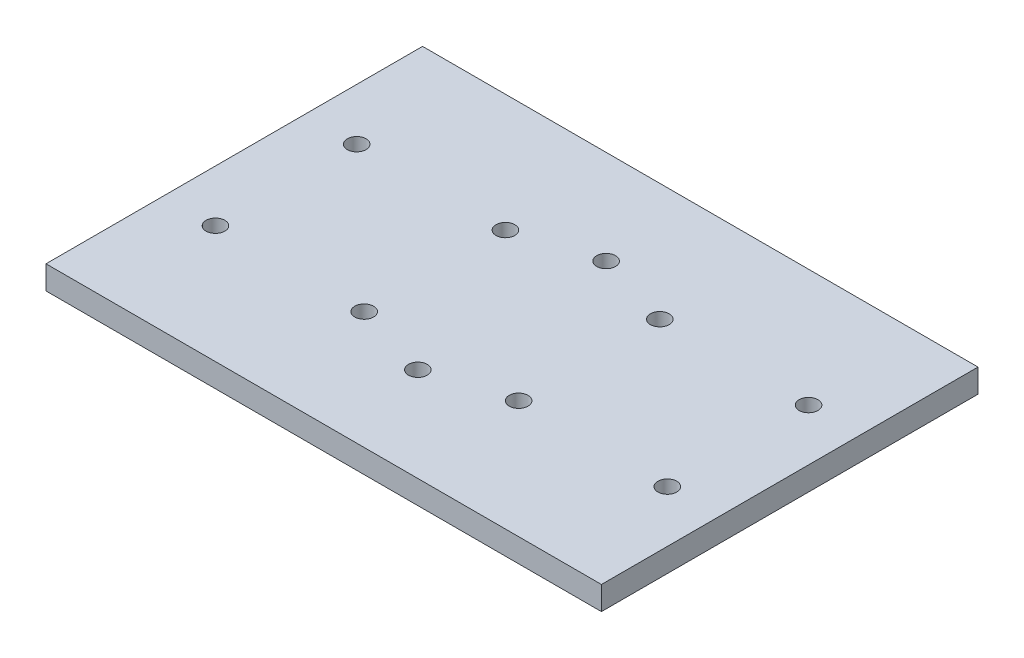
ISO-10303-21;
HEADER;
FILE_DESCRIPTION(('STEP AP214'),'2;1');
FILE_NAME('part.step','',(''),(''),'','','');
FILE_SCHEMA(('AUTOMOTIVE_DESIGN { 1 0 10303 214 1 1 1 1 }'));
ENDSEC;
DATA;
#1=APPLICATION_CONTEXT('core data for automotive mechanical design processes');
#2=APPLICATION_PROTOCOL_DEFINITION('international standard','automotive_design',2000,#1);
#3=PRODUCT_CONTEXT('',#1,'mechanical');
#4=PRODUCT('Part','Part','',(#3));
#5=PRODUCT_RELATED_PRODUCT_CATEGORY('part','',(#4));
#6=PRODUCT_DEFINITION_FORMATION('','',#4);
#7=PRODUCT_DEFINITION_CONTEXT('part definition',#1,'design');
#8=PRODUCT_DEFINITION('design','',#6,#7);
#9=PRODUCT_DEFINITION_SHAPE('','',#8);
#10=(LENGTH_UNIT() NAMED_UNIT(*) SI_UNIT(.MILLI.,.METRE.));
#11=(NAMED_UNIT(*) PLANE_ANGLE_UNIT() SI_UNIT($,.RADIAN.));
#12=(NAMED_UNIT(*) SI_UNIT($,.STERADIAN.) SOLID_ANGLE_UNIT());
#13=UNCERTAINTY_MEASURE_WITH_UNIT(LENGTH_MEASURE(1.E-05),#10,'distance_accuracy_value','');
#14=(GEOMETRIC_REPRESENTATION_CONTEXT(3) GLOBAL_UNCERTAINTY_ASSIGNED_CONTEXT((#13)) GLOBAL_UNIT_ASSIGNED_CONTEXT((#10,
#11,#12)) REPRESENTATION_CONTEXT('',''));
#15=CARTESIAN_POINT('',(0.,0.,0.));
#16=DIRECTION('',(0.,0.,1.));
#17=DIRECTION('',(1.,0.,0.));
#18=AXIS2_PLACEMENT_3D('',#15,#16,#17);
#19=CARTESIAN_POINT('',(-300.057142857143,5.,-77.9642857142857));
#20=DIRECTION('',(1.,0.,0.));
#21=DIRECTION('',(0.,0.,-1.));
#22=AXIS2_PLACEMENT_3D('',#19,#20,#21);
#23=PLANE('',#22);
#24=DIRECTION('',(0.,0.,1.));
#25=VECTOR('',#24,1.);
#26=CARTESIAN_POINT('',(-300.057142857143,0.,-77.9642857142857));
#27=LINE('',#26,#25);
#28=CARTESIAN_POINT('',(-300.057142857143,0.,-77.9642857142857));
#29=VERTEX_POINT('',#28);
#30=CARTESIAN_POINT('',(-300.057142857143,0.,2.03571428571428));
#31=VERTEX_POINT('',#30);
#32=EDGE_CURVE('E96',#29,#31,#27,.T.);
#33=ORIENTED_EDGE('',*,*,#32,.T.);
#34=DIRECTION('',(0.,-1.,0.));
#35=VECTOR('',#34,1.);
#36=CARTESIAN_POINT('',(-300.057142857143,5.,2.03571428571428));
#37=LINE('',#36,#35);
#38=CARTESIAN_POINT('',(-300.057142857143,5.,2.03571428571428));
#39=VERTEX_POINT('',#38);
#40=EDGE_CURVE('E11',#39,#31,#37,.T.);
#41=ORIENTED_EDGE('',*,*,#40,.F.);
#42=DIRECTION('',(0.,0.,1.));
#43=VECTOR('',#42,1.);
#44=CARTESIAN_POINT('',(-300.057142857143,5.,-77.9642857142857));
#45=LINE('',#44,#43);
#46=CARTESIAN_POINT('',(-300.057142857143,5.,-77.9642857142857));
#47=VERTEX_POINT('',#46);
#48=EDGE_CURVE('E84',#47,#39,#45,.T.);
#49=ORIENTED_EDGE('',*,*,#48,.F.);
#50=DIRECTION('',(0.,-1.,0.));
#51=VECTOR('',#50,1.);
#52=CARTESIAN_POINT('',(-300.057142857143,5.,-77.9642857142857));
#53=LINE('',#52,#51);
#54=EDGE_CURVE('E92',#47,#29,#53,.T.);
#55=ORIENTED_EDGE('',*,*,#54,.T.);
#56=EDGE_LOOP('',(#33,#41,#49,#55));
#57=FACE_BOUND('',#56,.T.);
#58=ADVANCED_FACE('F33',(#57),#23,.F.);
#59=CARTESIAN_POINT('',(-300.057142857143,5.,2.03571428571428));
#60=DIRECTION('',(0.,0.,-1.));
#61=DIRECTION('',(-1.,0.,0.));
#62=AXIS2_PLACEMENT_3D('',#59,#60,#61);
#63=PLANE('',#62);
#64=DIRECTION('',(1.,0.,0.));
#65=VECTOR('',#64,1.);
#66=CARTESIAN_POINT('',(-300.057142857143,0.,2.03571428571428));
#67=LINE('',#66,#65);
#68=CARTESIAN_POINT('',(-182.057142857143,0.,2.03571428571428));
#69=VERTEX_POINT('',#68);
#70=EDGE_CURVE('E88',#31,#69,#67,.T.);
#71=ORIENTED_EDGE('',*,*,#70,.T.);
#72=DIRECTION('',(0.,-1.,0.));
#73=VECTOR('',#72,1.);
#74=CARTESIAN_POINT('',(-182.057142857143,5.,2.03571428571428));
#75=LINE('',#74,#73);
#76=CARTESIAN_POINT('',(-182.057142857143,5.,2.03571428571428));
#77=VERTEX_POINT('',#76);
#78=EDGE_CURVE('E41',#77,#69,#75,.T.);
#79=ORIENTED_EDGE('',*,*,#78,.F.);
#80=DIRECTION('',(1.,0.,0.));
#81=VECTOR('',#80,1.);
#82=CARTESIAN_POINT('',(-300.057142857143,5.,2.03571428571428));
#83=LINE('',#82,#81);
#84=EDGE_CURVE('E79',#39,#77,#83,.T.);
#85=ORIENTED_EDGE('',*,*,#84,.F.);
#86=ORIENTED_EDGE('',*,*,#40,.T.);
#87=EDGE_LOOP('',(#71,#79,#85,#86));
#88=FACE_BOUND('',#87,.T.);
#89=ADVANCED_FACE('F87',(#88),#63,.F.);
#90=CARTESIAN_POINT('',(-182.057142857143,5.,-77.9642857142857));
#91=DIRECTION('',(-1.,0.,0.));
#92=DIRECTION('',(0.,0.,1.));
#93=AXIS2_PLACEMENT_3D('',#90,#91,#92);
#94=PLANE('',#93);
#95=DIRECTION('',(0.,0.,-1.));
#96=VECTOR('',#95,1.);
#97=CARTESIAN_POINT('',(-182.057142857143,0.,-77.9642857142857));
#98=LINE('',#97,#96);
#99=CARTESIAN_POINT('',(-182.057142857143,0.,-77.9642857142857));
#100=VERTEX_POINT('',#99);
#101=EDGE_CURVE('E66',#69,#100,#98,.T.);
#102=ORIENTED_EDGE('',*,*,#101,.T.);
#103=DIRECTION('',(0.,-1.,0.));
#104=VECTOR('',#103,1.);
#105=CARTESIAN_POINT('',(-182.057142857143,5.,-77.9642857142857));
#106=LINE('',#105,#104);
#107=CARTESIAN_POINT('',(-182.057142857143,5.,-77.9642857142857));
#108=VERTEX_POINT('',#107);
#109=EDGE_CURVE('E89',#108,#100,#106,.T.);
#110=ORIENTED_EDGE('',*,*,#109,.F.);
#111=DIRECTION('',(0.,0.,-1.));
#112=VECTOR('',#111,1.);
#113=CARTESIAN_POINT('',(-182.057142857143,5.,-77.9642857142857));
#114=LINE('',#113,#112);
#115=EDGE_CURVE('E82',#77,#108,#114,.T.);
#116=ORIENTED_EDGE('',*,*,#115,.F.);
#117=ORIENTED_EDGE('',*,*,#78,.T.);
#118=EDGE_LOOP('',(#102,#110,#116,#117));
#119=FACE_BOUND('',#118,.T.);
#120=ADVANCED_FACE('F90',(#119),#94,.F.);
#121=CARTESIAN_POINT('',(-300.057142857143,5.,-77.9642857142857));
#122=DIRECTION('',(0.,0.,1.));
#123=DIRECTION('',(1.,0.,0.));
#124=AXIS2_PLACEMENT_3D('',#121,#122,#123);
#125=PLANE('',#124);
#126=DIRECTION('',(-1.,0.,0.));
#127=VECTOR('',#126,1.);
#128=CARTESIAN_POINT('',(-300.057142857143,0.,-77.9642857142857));
#129=LINE('',#128,#127);
#130=EDGE_CURVE('E72',#100,#29,#129,.T.);
#131=ORIENTED_EDGE('',*,*,#130,.T.);
#132=ORIENTED_EDGE('',*,*,#54,.F.);
#133=DIRECTION('',(-1.,0.,0.));
#134=VECTOR('',#133,1.);
#135=CARTESIAN_POINT('',(-300.057142857143,5.,-77.9642857142857));
#136=LINE('',#135,#134);
#137=EDGE_CURVE('E49',#108,#47,#136,.T.);
#138=ORIENTED_EDGE('',*,*,#137,.F.);
#139=ORIENTED_EDGE('',*,*,#109,.T.);
#140=EDGE_LOOP('',(#131,#132,#138,#139));
#141=FACE_BOUND('',#140,.T.);
#142=ADVANCED_FACE('F104',(#141),#125,.F.);
#143=CARTESIAN_POINT('',(0.,5.,0.));
#144=DIRECTION('',(0.,1.,0.));
#145=DIRECTION('',(0.,0.,1.));
#146=AXIS2_PLACEMENT_3D('',#143,#144,#145);
#147=PLANE('',#146);
#148=CARTESIAN_POINT('',(-241.057142857143,5.,-17.9642857142857));
#149=DIRECTION('',(0.,1.,0.));
#150=DIRECTION('',(0.,0.,-1.));
#151=AXIS2_PLACEMENT_3D('',#148,#149,#150);
#152=CIRCLE('',#151,2.);
#153=CARTESIAN_POINT('',(-241.057142857143,5.,-19.9642857142857));
#154=VERTEX_POINT('',#153);
#155=EDGE_CURVE('E116',#154,#154,#152,.T.);
#156=ORIENTED_EDGE('',*,*,#155,.F.);
#157=EDGE_LOOP('',(#156));
#158=FACE_BOUND('',#157,.T.);
#159=CARTESIAN_POINT('',(-257.457142857143,5.,-52.964285714286));
#160=DIRECTION('',(0.,1.,0.));
#161=DIRECTION('',(0.,0.,1.));
#162=AXIS2_PLACEMENT_3D('',#159,#160,#161);
#163=CIRCLE('',#162,2.);
#164=CARTESIAN_POINT('',(-257.457142857143,5.,-50.964285714286));
#165=VERTEX_POINT('',#164);
#166=EDGE_CURVE('E142',#165,#165,#163,.T.);
#167=ORIENTED_EDGE('',*,*,#166,.F.);
#168=EDGE_LOOP('',(#167));
#169=FACE_BOUND('',#168,.T.);
#170=CARTESIAN_POINT('',(-224.657142857143,5.,-52.964285714286));
#171=DIRECTION('',(0.,1.,0.));
#172=DIRECTION('',(0.,0.,-1.));
#173=AXIS2_PLACEMENT_3D('',#170,#171,#172);
#174=CIRCLE('',#173,2.);
#175=CARTESIAN_POINT('',(-224.657142857143,5.,-54.964285714286));
#176=VERTEX_POINT('',#175);
#177=EDGE_CURVE('E136',#176,#176,#174,.T.);
#178=ORIENTED_EDGE('',*,*,#177,.F.);
#179=EDGE_LOOP('',(#178));
#180=FACE_BOUND('',#179,.T.);
#181=CARTESIAN_POINT('',(-193.057142857143,5.,-52.964285714286));
#182=DIRECTION('',(0.,1.,0.));
#183=DIRECTION('',(0.,0.,-1.));
#184=AXIS2_PLACEMENT_3D('',#181,#182,#183);
#185=CIRCLE('',#184,2.);
#186=CARTESIAN_POINT('',(-193.057142857143,5.,-54.964285714286));
#187=VERTEX_POINT('',#186);
#188=EDGE_CURVE('E130',#187,#187,#185,.T.);
#189=ORIENTED_EDGE('',*,*,#188,.F.);
#190=EDGE_LOOP('',(#189));
#191=FACE_BOUND('',#190,.T.);
#192=CARTESIAN_POINT('',(-193.057142857143,5.,-22.9642857142855));
#193=DIRECTION('',(0.,1.,0.));
#194=DIRECTION('',(0.,0.,1.));
#195=AXIS2_PLACEMENT_3D('',#192,#193,#194);
#196=CIRCLE('',#195,2.);
#197=CARTESIAN_POINT('',(-193.057142857143,5.,-20.9642857142855));
#198=VERTEX_POINT('',#197);
#199=EDGE_CURVE('E123',#198,#198,#196,.T.);
#200=ORIENTED_EDGE('',*,*,#199,.F.);
#201=EDGE_LOOP('',(#200));
#202=FACE_BOUND('',#201,.T.);
#203=CARTESIAN_POINT('',(-241.057142857143,5.,-57.9642857142857));
#204=DIRECTION('',(0.,1.,0.));
#205=DIRECTION('',(0.,0.,1.));
#206=AXIS2_PLACEMENT_3D('',#203,#204,#205);
#207=CIRCLE('',#206,2.);
#208=CARTESIAN_POINT('',(-241.057142857143,5.,-55.9642857142857));
#209=VERTEX_POINT('',#208);
#210=EDGE_CURVE('E122',#209,#209,#207,.T.);
#211=ORIENTED_EDGE('',*,*,#210,.F.);
#212=EDGE_LOOP('',(#211));
#213=FACE_BOUND('',#212,.T.);
#214=CARTESIAN_POINT('',(-289.057142857143,5.,-22.9642857142855));
#215=DIRECTION('',(0.,1.,0.));
#216=DIRECTION('',(0.,0.,-1.));
#217=AXIS2_PLACEMENT_3D('',#214,#215,#216);
#218=CIRCLE('',#217,2.);
#219=CARTESIAN_POINT('',(-289.057142857143,5.,-24.9642857142855));
#220=VERTEX_POINT('',#219);
#221=EDGE_CURVE('E164',#220,#220,#218,.T.);
#222=ORIENTED_EDGE('',*,*,#221,.F.);
#223=EDGE_LOOP('',(#222));
#224=FACE_BOUND('',#223,.T.);
#225=CARTESIAN_POINT('',(-257.457142857143,5.,-22.9642857142855));
#226=DIRECTION('',(0.,1.,0.));
#227=DIRECTION('',(0.,0.,-1.));
#228=AXIS2_PLACEMENT_3D('',#225,#226,#227);
#229=CIRCLE('',#228,2.);
#230=CARTESIAN_POINT('',(-257.457142857143,5.,-24.9642857142855));
#231=VERTEX_POINT('',#230);
#232=EDGE_CURVE('E147',#231,#231,#229,.T.);
#233=ORIENTED_EDGE('',*,*,#232,.F.);
#234=EDGE_LOOP('',(#233));
#235=FACE_BOUND('',#234,.T.);
#236=CARTESIAN_POINT('',(-224.657142857143,5.,-22.9642857142855));
#237=DIRECTION('',(0.,1.,0.));
#238=DIRECTION('',(0.,0.,1.));
#239=AXIS2_PLACEMENT_3D('',#236,#237,#238);
#240=CIRCLE('',#239,2.);
#241=CARTESIAN_POINT('',(-224.657142857143,5.,-20.9642857142855));
#242=VERTEX_POINT('',#241);
#243=EDGE_CURVE('E154',#242,#242,#240,.T.);
#244=ORIENTED_EDGE('',*,*,#243,.F.);
#245=EDGE_LOOP('',(#244));
#246=FACE_BOUND('',#245,.T.);
#247=CARTESIAN_POINT('',(-289.057142857143,5.,-52.964285714286));
#248=DIRECTION('',(0.,1.,0.));
#249=DIRECTION('',(0.,0.,1.));
#250=AXIS2_PLACEMENT_3D('',#247,#248,#249);
#251=CIRCLE('',#250,2.);
#252=CARTESIAN_POINT('',(-289.057142857143,5.,-50.964285714286));
#253=VERTEX_POINT('',#252);
#254=EDGE_CURVE('E110',#253,#253,#251,.T.);
#255=ORIENTED_EDGE('',*,*,#254,.F.);
#256=EDGE_LOOP('',(#255));
#257=FACE_BOUND('',#256,.T.);
#258=ORIENTED_EDGE('',*,*,#48,.T.);
#259=ORIENTED_EDGE('',*,*,#84,.T.);
#260=ORIENTED_EDGE('',*,*,#115,.T.);
#261=ORIENTED_EDGE('',*,*,#137,.T.);
#262=EDGE_LOOP('',(#258,#259,#260,#261));
#263=FACE_BOUND('',#262,.T.);
#264=ADVANCED_FACE('F80',(#158,#169,#180,#191,#202,#213,#224,#235,#246,#257,#263),#147,.T.);
#265=CARTESIAN_POINT('',(0.,0.,0.));
#266=DIRECTION('',(0.,1.,0.));
#267=DIRECTION('',(0.,0.,1.));
#268=AXIS2_PLACEMENT_3D('',#265,#266,#267);
#269=PLANE('',#268);
#270=CARTESIAN_POINT('',(-241.057142857143,0.,-17.9642857142857));
#271=DIRECTION('',(0.,1.,0.));
#272=DIRECTION('',(0.,0.,-1.));
#273=AXIS2_PLACEMENT_3D('',#270,#271,#272);
#274=CIRCLE('',#273,2.);
#275=CARTESIAN_POINT('',(-241.057142857143,0.,-19.9642857142857));
#276=VERTEX_POINT('',#275);
#277=EDGE_CURVE('E119',#276,#276,#274,.T.);
#278=ORIENTED_EDGE('',*,*,#277,.T.);
#279=EDGE_LOOP('',(#278));
#280=FACE_BOUND('',#279,.T.);
#281=CARTESIAN_POINT('',(-257.457142857143,0.,-52.964285714286));
#282=DIRECTION('',(0.,1.,0.));
#283=DIRECTION('',(0.,0.,1.));
#284=AXIS2_PLACEMENT_3D('',#281,#282,#283);
#285=CIRCLE('',#284,2.);
#286=CARTESIAN_POINT('',(-257.457142857143,0.,-50.964285714286));
#287=VERTEX_POINT('',#286);
#288=EDGE_CURVE('E113',#287,#287,#285,.T.);
#289=ORIENTED_EDGE('',*,*,#288,.T.);
#290=EDGE_LOOP('',(#289));
#291=FACE_BOUND('',#290,.T.);
#292=CARTESIAN_POINT('',(-224.657142857143,0.,-52.964285714286));
#293=DIRECTION('',(0.,1.,0.));
#294=DIRECTION('',(0.,0.,-1.));
#295=AXIS2_PLACEMENT_3D('',#292,#293,#294);
#296=CIRCLE('',#295,2.);
#297=CARTESIAN_POINT('',(-224.657142857143,0.,-54.964285714286));
#298=VERTEX_POINT('',#297);
#299=EDGE_CURVE('E139',#298,#298,#296,.T.);
#300=ORIENTED_EDGE('',*,*,#299,.T.);
#301=EDGE_LOOP('',(#300));
#302=FACE_BOUND('',#301,.T.);
#303=CARTESIAN_POINT('',(-193.057142857143,0.,-52.964285714286));
#304=DIRECTION('',(0.,1.,0.));
#305=DIRECTION('',(0.,0.,-1.));
#306=AXIS2_PLACEMENT_3D('',#303,#304,#305);
#307=CIRCLE('',#306,2.);
#308=CARTESIAN_POINT('',(-193.057142857143,0.,-54.964285714286));
#309=VERTEX_POINT('',#308);
#310=EDGE_CURVE('E133',#309,#309,#307,.T.);
#311=ORIENTED_EDGE('',*,*,#310,.T.);
#312=EDGE_LOOP('',(#311));
#313=FACE_BOUND('',#312,.T.);
#314=CARTESIAN_POINT('',(-193.057142857143,0.,-22.9642857142855));
#315=DIRECTION('',(0.,1.,0.));
#316=DIRECTION('',(0.,0.,1.));
#317=AXIS2_PLACEMENT_3D('',#314,#315,#316);
#318=CIRCLE('',#317,2.);
#319=CARTESIAN_POINT('',(-193.057142857143,0.,-20.9642857142855));
#320=VERTEX_POINT('',#319);
#321=EDGE_CURVE('E126',#320,#320,#318,.T.);
#322=ORIENTED_EDGE('',*,*,#321,.T.);
#323=EDGE_LOOP('',(#322));
#324=FACE_BOUND('',#323,.T.);
#325=CARTESIAN_POINT('',(-241.057142857143,0.,-57.9642857142857));
#326=DIRECTION('',(0.,1.,0.));
#327=DIRECTION('',(0.,0.,1.));
#328=AXIS2_PLACEMENT_3D('',#325,#326,#327);
#329=CIRCLE('',#328,2.);
#330=CARTESIAN_POINT('',(-241.057142857143,0.,-55.9642857142857));
#331=VERTEX_POINT('',#330);
#332=EDGE_CURVE('E161',#331,#331,#329,.T.);
#333=ORIENTED_EDGE('',*,*,#332,.T.);
#334=EDGE_LOOP('',(#333));
#335=FACE_BOUND('',#334,.T.);
#336=CARTESIAN_POINT('',(-289.057142857143,0.,-22.9642857142855));
#337=DIRECTION('',(0.,1.,0.));
#338=DIRECTION('',(0.,0.,-1.));
#339=AXIS2_PLACEMENT_3D('',#336,#337,#338);
#340=CIRCLE('',#339,2.);
#341=CARTESIAN_POINT('',(-289.057142857143,0.,-24.9642857142855));
#342=VERTEX_POINT('',#341);
#343=EDGE_CURVE('E151',#342,#342,#340,.T.);
#344=ORIENTED_EDGE('',*,*,#343,.T.);
#345=EDGE_LOOP('',(#344));
#346=FACE_BOUND('',#345,.T.);
#347=CARTESIAN_POINT('',(-257.457142857143,0.,-22.9642857142855));
#348=DIRECTION('',(0.,1.,0.));
#349=DIRECTION('',(0.,0.,-1.));
#350=AXIS2_PLACEMENT_3D('',#347,#348,#349);
#351=CIRCLE('',#350,2.);
#352=CARTESIAN_POINT('',(-257.457142857143,0.,-24.9642857142855));
#353=VERTEX_POINT('',#352);
#354=EDGE_CURVE('E150',#353,#353,#351,.T.);
#355=ORIENTED_EDGE('',*,*,#354,.T.);
#356=EDGE_LOOP('',(#355));
#357=FACE_BOUND('',#356,.T.);
#358=CARTESIAN_POINT('',(-224.657142857143,0.,-22.9642857142855));
#359=DIRECTION('',(0.,1.,0.));
#360=DIRECTION('',(0.,0.,1.));
#361=AXIS2_PLACEMENT_3D('',#358,#359,#360);
#362=CIRCLE('',#361,2.);
#363=CARTESIAN_POINT('',(-224.657142857143,0.,-20.9642857142855));
#364=VERTEX_POINT('',#363);
#365=EDGE_CURVE('E127',#364,#364,#362,.T.);
#366=ORIENTED_EDGE('',*,*,#365,.T.);
#367=EDGE_LOOP('',(#366));
#368=FACE_BOUND('',#367,.T.);
#369=CARTESIAN_POINT('',(-289.057142857143,0.,-52.964285714286));
#370=DIRECTION('',(0.,1.,0.));
#371=DIRECTION('',(0.,0.,1.));
#372=AXIS2_PLACEMENT_3D('',#369,#370,#371);
#373=CIRCLE('',#372,2.);
#374=CARTESIAN_POINT('',(-289.057142857143,0.,-50.964285714286));
#375=VERTEX_POINT('',#374);
#376=EDGE_CURVE('E99',#375,#375,#373,.T.);
#377=ORIENTED_EDGE('',*,*,#376,.T.);
#378=EDGE_LOOP('',(#377));
#379=FACE_BOUND('',#378,.T.);
#380=ORIENTED_EDGE('',*,*,#32,.F.);
#381=ORIENTED_EDGE('',*,*,#130,.F.);
#382=ORIENTED_EDGE('',*,*,#101,.F.);
#383=ORIENTED_EDGE('',*,*,#70,.F.);
#384=EDGE_LOOP('',(#380,#381,#382,#383));
#385=FACE_BOUND('',#384,.T.);
#386=ADVANCED_FACE('F107',(#280,#291,#302,#313,#324,#335,#346,#357,#368,#379,#385),#269,.F.);
#387=CARTESIAN_POINT('',(-289.057142857143,0.,-52.964285714286));
#388=DIRECTION('',(0.,1.,0.));
#389=DIRECTION('',(0.,0.,1.));
#390=AXIS2_PLACEMENT_3D('',#387,#388,#389);
#391=CYLINDRICAL_SURFACE('',#390,2.);
#392=ORIENTED_EDGE('',*,*,#376,.F.);
#393=EDGE_LOOP('',(#392));
#394=FACE_BOUND('',#393,.T.);
#395=ORIENTED_EDGE('',*,*,#254,.T.);
#396=EDGE_LOOP('',(#395));
#397=FACE_BOUND('',#396,.T.);
#398=ADVANCED_FACE('F190',(#394,#397),#391,.F.);
#399=CARTESIAN_POINT('',(-224.657142857143,0.,-22.9642857142855));
#400=DIRECTION('',(0.,1.,0.));
#401=DIRECTION('',(0.,0.,1.));
#402=AXIS2_PLACEMENT_3D('',#399,#400,#401);
#403=CYLINDRICAL_SURFACE('',#402,2.);
#404=ORIENTED_EDGE('',*,*,#365,.F.);
#405=EDGE_LOOP('',(#404));
#406=FACE_BOUND('',#405,.T.);
#407=ORIENTED_EDGE('',*,*,#243,.T.);
#408=EDGE_LOOP('',(#407));
#409=FACE_BOUND('',#408,.T.);
#410=ADVANCED_FACE('F192',(#406,#409),#403,.F.);
#411=CARTESIAN_POINT('',(-257.457142857143,0.,-22.9642857142855));
#412=DIRECTION('',(0.,1.,0.));
#413=DIRECTION('',(0.,0.,1.));
#414=AXIS2_PLACEMENT_3D('',#411,#412,#413);
#415=CYLINDRICAL_SURFACE('',#414,2.);
#416=ORIENTED_EDGE('',*,*,#354,.F.);
#417=EDGE_LOOP('',(#416));
#418=FACE_BOUND('',#417,.T.);
#419=ORIENTED_EDGE('',*,*,#232,.T.);
#420=EDGE_LOOP('',(#419));
#421=FACE_BOUND('',#420,.T.);
#422=ADVANCED_FACE('F176',(#418,#421),#415,.F.);
#423=CARTESIAN_POINT('',(-289.057142857143,0.,-22.9642857142855));
#424=DIRECTION('',(0.,1.,0.));
#425=DIRECTION('',(0.,0.,1.));
#426=AXIS2_PLACEMENT_3D('',#423,#424,#425);
#427=CYLINDRICAL_SURFACE('',#426,2.);
#428=ORIENTED_EDGE('',*,*,#343,.F.);
#429=EDGE_LOOP('',(#428));
#430=FACE_BOUND('',#429,.T.);
#431=ORIENTED_EDGE('',*,*,#221,.T.);
#432=EDGE_LOOP('',(#431));
#433=FACE_BOUND('',#432,.T.);
#434=ADVANCED_FACE('F172',(#430,#433),#427,.F.);
#435=CARTESIAN_POINT('',(-241.057142857143,0.,-57.9642857142857));
#436=DIRECTION('',(0.,1.,0.));
#437=DIRECTION('',(0.,0.,1.));
#438=AXIS2_PLACEMENT_3D('',#435,#436,#437);
#439=CYLINDRICAL_SURFACE('',#438,2.);
#440=ORIENTED_EDGE('',*,*,#332,.F.);
#441=EDGE_LOOP('',(#440));
#442=FACE_BOUND('',#441,.T.);
#443=ORIENTED_EDGE('',*,*,#210,.T.);
#444=EDGE_LOOP('',(#443));
#445=FACE_BOUND('',#444,.T.);
#446=ADVANCED_FACE('F175',(#442,#445),#439,.F.);
#447=CARTESIAN_POINT('',(-193.057142857143,0.,-22.9642857142855));
#448=DIRECTION('',(0.,1.,0.));
#449=DIRECTION('',(0.,0.,1.));
#450=AXIS2_PLACEMENT_3D('',#447,#448,#449);
#451=CYLINDRICAL_SURFACE('',#450,2.);
#452=ORIENTED_EDGE('',*,*,#321,.F.);
#453=EDGE_LOOP('',(#452));
#454=FACE_BOUND('',#453,.T.);
#455=ORIENTED_EDGE('',*,*,#199,.T.);
#456=EDGE_LOOP('',(#455));
#457=FACE_BOUND('',#456,.T.);
#458=ADVANCED_FACE('F263',(#454,#457),#451,.F.);
#459=CARTESIAN_POINT('',(-193.057142857143,0.,-52.964285714286));
#460=DIRECTION('',(0.,1.,0.));
#461=DIRECTION('',(0.,0.,1.));
#462=AXIS2_PLACEMENT_3D('',#459,#460,#461);
#463=CYLINDRICAL_SURFACE('',#462,2.);
#464=ORIENTED_EDGE('',*,*,#310,.F.);
#465=EDGE_LOOP('',(#464));
#466=FACE_BOUND('',#465,.T.);
#467=ORIENTED_EDGE('',*,*,#188,.T.);
#468=EDGE_LOOP('',(#467));
#469=FACE_BOUND('',#468,.T.);
#470=ADVANCED_FACE('F273',(#466,#469),#463,.F.);
#471=CARTESIAN_POINT('',(-224.657142857143,0.,-52.964285714286));
#472=DIRECTION('',(0.,1.,0.));
#473=DIRECTION('',(0.,0.,1.));
#474=AXIS2_PLACEMENT_3D('',#471,#472,#473);
#475=CYLINDRICAL_SURFACE('',#474,2.);
#476=ORIENTED_EDGE('',*,*,#299,.F.);
#477=EDGE_LOOP('',(#476));
#478=FACE_BOUND('',#477,.T.);
#479=ORIENTED_EDGE('',*,*,#177,.T.);
#480=EDGE_LOOP('',(#479));
#481=FACE_BOUND('',#480,.T.);
#482=ADVANCED_FACE('F283',(#478,#481),#475,.F.);
#483=CARTESIAN_POINT('',(-257.457142857143,0.,-52.964285714286));
#484=DIRECTION('',(0.,1.,0.));
#485=DIRECTION('',(0.,0.,1.));
#486=AXIS2_PLACEMENT_3D('',#483,#484,#485);
#487=CYLINDRICAL_SURFACE('',#486,2.);
#488=ORIENTED_EDGE('',*,*,#288,.F.);
#489=EDGE_LOOP('',(#488));
#490=FACE_BOUND('',#489,.T.);
#491=ORIENTED_EDGE('',*,*,#166,.T.);
#492=EDGE_LOOP('',(#491));
#493=FACE_BOUND('',#492,.T.);
#494=ADVANCED_FACE('F293',(#490,#493),#487,.F.);
#495=CARTESIAN_POINT('',(-241.057142857143,0.,-17.9642857142857));
#496=DIRECTION('',(0.,1.,0.));
#497=DIRECTION('',(0.,0.,1.));
#498=AXIS2_PLACEMENT_3D('',#495,#496,#497);
#499=CYLINDRICAL_SURFACE('',#498,2.);
#500=ORIENTED_EDGE('',*,*,#277,.F.);
#501=EDGE_LOOP('',(#500));
#502=FACE_BOUND('',#501,.T.);
#503=ORIENTED_EDGE('',*,*,#155,.T.);
#504=EDGE_LOOP('',(#503));
#505=FACE_BOUND('',#504,.T.);
#506=ADVANCED_FACE('F303',(#502,#505),#499,.F.);
#507=CLOSED_SHELL('',(#58,#89,#120,#142,#264,#386,#398,#410,#422,#434,#446,#458,#470,#482,#494,#506));
#508=MANIFOLD_SOLID_BREP('B2',#507);
#509=ADVANCED_BREP_SHAPE_REPRESENTATION('',(#18,#508),#14);
#510=SHAPE_DEFINITION_REPRESENTATION(#9,#509);
ENDSEC;
END-ISO-10303-21;
